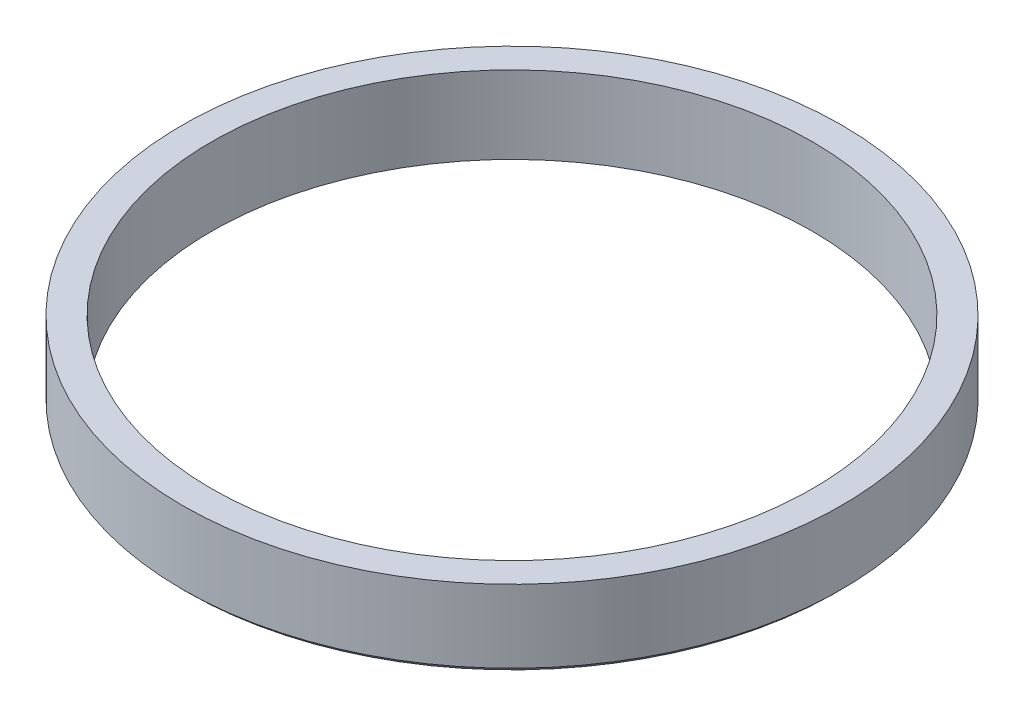
ISO-10303-21;
HEADER;
FILE_DESCRIPTION(('STEP AP214'),'2;1');
FILE_NAME('part.step','',(''),(''),'','','');
FILE_SCHEMA(('AUTOMOTIVE_DESIGN { 1 0 10303 214 1 1 1 1 }'));
ENDSEC;
DATA;
#1=APPLICATION_CONTEXT('core data for automotive mechanical design processes');
#2=APPLICATION_PROTOCOL_DEFINITION('international standard','automotive_design',2000,#1);
#3=PRODUCT_CONTEXT('',#1,'mechanical');
#4=PRODUCT('Part','Part','',(#3));
#5=PRODUCT_RELATED_PRODUCT_CATEGORY('part','',(#4));
#6=PRODUCT_DEFINITION_FORMATION('','',#4);
#7=PRODUCT_DEFINITION_CONTEXT('part definition',#1,'design');
#8=PRODUCT_DEFINITION('design','',#6,#7);
#9=PRODUCT_DEFINITION_SHAPE('','',#8);
#10=(LENGTH_UNIT() NAMED_UNIT(*) SI_UNIT(.MILLI.,.METRE.));
#11=(NAMED_UNIT(*) PLANE_ANGLE_UNIT() SI_UNIT($,.RADIAN.));
#12=(NAMED_UNIT(*) SI_UNIT($,.STERADIAN.) SOLID_ANGLE_UNIT());
#13=UNCERTAINTY_MEASURE_WITH_UNIT(LENGTH_MEASURE(1.E-05),#10,'distance_accuracy_value','');
#14=(GEOMETRIC_REPRESENTATION_CONTEXT(3) GLOBAL_UNCERTAINTY_ASSIGNED_CONTEXT((#13)) GLOBAL_UNIT_ASSIGNED_CONTEXT((#10,
#11,#12)) REPRESENTATION_CONTEXT('',''));
#15=CARTESIAN_POINT('',(0.,0.,0.));
#16=DIRECTION('',(0.,0.,1.));
#17=DIRECTION('',(1.,0.,0.));
#18=AXIS2_PLACEMENT_3D('',#15,#16,#17);
#19=CARTESIAN_POINT('',(0.,0.,0.));
#20=DIRECTION('',(0.,-1.,0.));
#21=DIRECTION('',(0.,0.,-1.));
#22=AXIS2_PLACEMENT_3D('',#19,#20,#21);
#23=CYLINDRICAL_SURFACE('',#22,62.);
#24=CARTESIAN_POINT('',(0.,16.,0.));
#25=DIRECTION('',(0.,-1.,0.));
#26=DIRECTION('',(0.,0.,-1.));
#27=AXIS2_PLACEMENT_3D('',#24,#25,#26);
#28=CIRCLE('',#27,62.);
#29=CARTESIAN_POINT('',(0.,16.,-62.));
#30=VERTEX_POINT('',#29);
#31=EDGE_CURVE('E54',#30,#30,#28,.T.);
#32=ORIENTED_EDGE('',*,*,#31,.F.);
#33=EDGE_LOOP('',(#32));
#34=FACE_BOUND('',#33,.T.);
#35=CARTESIAN_POINT('',(0.,0.,0.));
#36=DIRECTION('',(0.,-1.,0.));
#37=DIRECTION('',(0.,0.,-1.));
#38=AXIS2_PLACEMENT_3D('',#35,#36,#37);
#39=CIRCLE('',#38,62.);
#40=CARTESIAN_POINT('',(0.,0.,-62.));
#41=VERTEX_POINT('',#40);
#42=EDGE_CURVE('E45',#41,#41,#39,.T.);
#43=ORIENTED_EDGE('',*,*,#42,.T.);
#44=EDGE_LOOP('',(#43));
#45=FACE_BOUND('',#44,.T.);
#46=ADVANCED_FACE('F33',(#34,#45),#23,.F.);
#47=CARTESIAN_POINT('',(-62.,0.,0.));
#48=DIRECTION('',(0.,1.,0.));
#49=DIRECTION('',(0.,0.,1.));
#50=AXIS2_PLACEMENT_3D('',#47,#48,#49);
#51=PLANE('',#50);
#52=CARTESIAN_POINT('',(0.,0.,0.));
#53=DIRECTION('',(0.,1.,0.));
#54=DIRECTION('',(0.,0.,1.));
#55=AXIS2_PLACEMENT_3D('',#52,#53,#54);
#56=CIRCLE('',#55,67.);
#57=CARTESIAN_POINT('',(0.,0.,67.));
#58=VERTEX_POINT('',#57);
#59=EDGE_CURVE('E41',#58,#58,#56,.F.);
#60=ORIENTED_EDGE('',*,*,#59,.T.);
#61=EDGE_LOOP('',(#60));
#62=FACE_BOUND('',#61,.T.);
#63=ORIENTED_EDGE('',*,*,#42,.F.);
#64=EDGE_LOOP('',(#63));
#65=FACE_BOUND('',#64,.T.);
#66=ADVANCED_FACE('F62',(#62,#65),#51,.F.);
#67=CARTESIAN_POINT('',(0.,0.,0.));
#68=DIRECTION('',(0.,-1.,0.));
#69=DIRECTION('',(0.,0.,-1.));
#70=AXIS2_PLACEMENT_3D('',#67,#68,#69);
#71=CYLINDRICAL_SURFACE('',#70,68.);
#72=CARTESIAN_POINT('',(0.,1.00000000000001,0.));
#73=DIRECTION('',(0.,1.,0.));
#74=DIRECTION('',(0.,0.,1.));
#75=AXIS2_PLACEMENT_3D('',#72,#73,#74);
#76=CIRCLE('',#75,68.);
#77=CARTESIAN_POINT('',(0.,1.00000000000001,68.));
#78=VERTEX_POINT('',#77);
#79=EDGE_CURVE('E10',#78,#78,#76,.T.);
#80=ORIENTED_EDGE('',*,*,#79,.T.);
#81=EDGE_LOOP('',(#80));
#82=FACE_BOUND('',#81,.T.);
#83=CARTESIAN_POINT('',(0.,16.,0.));
#84=DIRECTION('',(0.,-1.,0.));
#85=DIRECTION('',(0.,0.,-1.));
#86=AXIS2_PLACEMENT_3D('',#83,#84,#85);
#87=CIRCLE('',#86,68.);
#88=CARTESIAN_POINT('',(0.,16.,-68.));
#89=VERTEX_POINT('',#88);
#90=EDGE_CURVE('E49',#89,#89,#87,.T.);
#91=ORIENTED_EDGE('',*,*,#90,.T.);
#92=EDGE_LOOP('',(#91));
#93=FACE_BOUND('',#92,.T.);
#94=ADVANCED_FACE('F66',(#82,#93),#71,.T.);
#95=CARTESIAN_POINT('',(-68.,16.,0.));
#96=DIRECTION('',(0.,-1.,0.));
#97=DIRECTION('',(0.,0.,-1.));
#98=AXIS2_PLACEMENT_3D('',#95,#96,#97);
#99=PLANE('',#98);
#100=ORIENTED_EDGE('',*,*,#90,.F.);
#101=EDGE_LOOP('',(#100));
#102=FACE_BOUND('',#101,.T.);
#103=ORIENTED_EDGE('',*,*,#31,.T.);
#104=EDGE_LOOP('',(#103));
#105=FACE_BOUND('',#104,.T.);
#106=ADVANCED_FACE('F58',(#102,#105),#99,.F.);
#107=CARTESIAN_POINT('',(0.,0.,0.));
#108=DIRECTION('',(0.,1.,0.));
#109=DIRECTION('',(0.,0.,1.));
#110=AXIS2_PLACEMENT_3D('',#107,#108,#109);
#111=CONICAL_SURFACE('',#110,67.,0.785398163397441);
#112=ORIENTED_EDGE('',*,*,#79,.F.);
#113=EDGE_LOOP('',(#112));
#114=FACE_BOUND('',#113,.T.);
#115=ORIENTED_EDGE('',*,*,#59,.F.);
#116=EDGE_LOOP('',(#115));
#117=FACE_BOUND('',#116,.T.);
#118=ADVANCED_FACE('F36',(#114,#117),#111,.T.);
#119=CLOSED_SHELL('',(#46,#66,#94,#106,#118));
#120=MANIFOLD_SOLID_BREP('B2',#119);
#121=ADVANCED_BREP_SHAPE_REPRESENTATION('',(#18,#120),#14);
#122=SHAPE_DEFINITION_REPRESENTATION(#9,#121);
ENDSEC;
END-ISO-10303-21;
